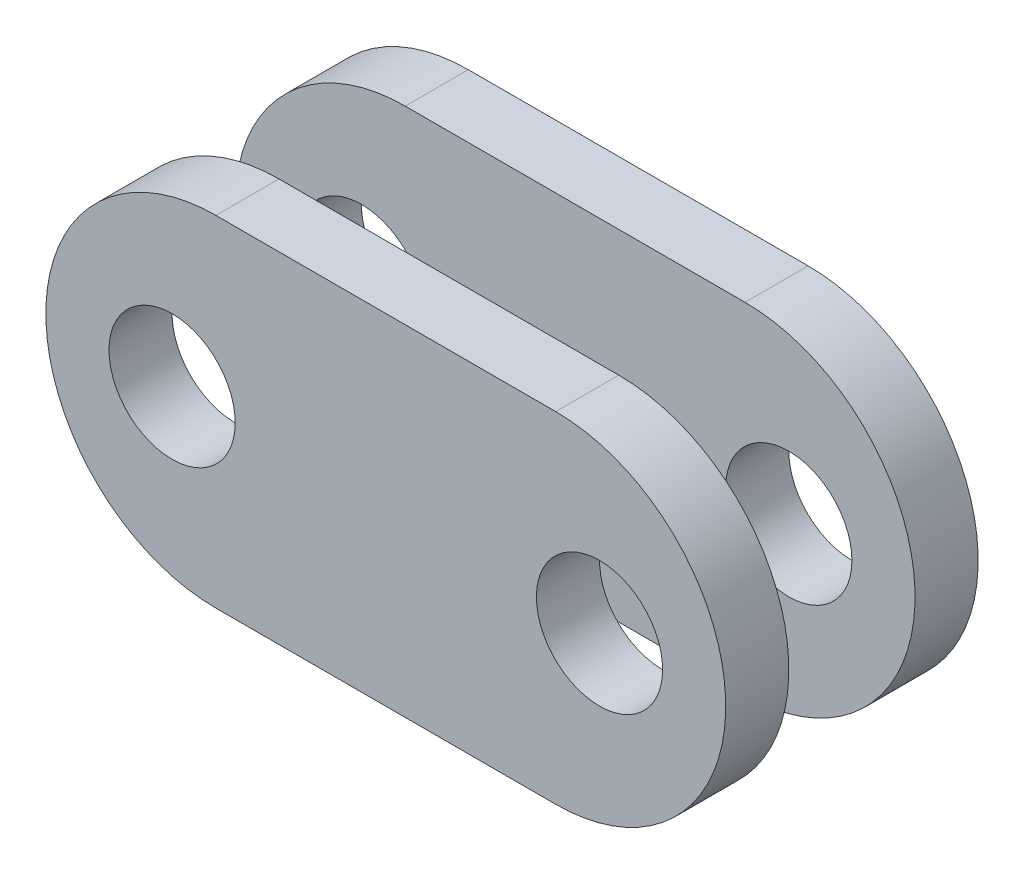
ISO-10303-21;
HEADER;
FILE_DESCRIPTION(('STEP AP214'),'2;1');
FILE_NAME('part.step','',(''),(''),'','','');
FILE_SCHEMA(('AUTOMOTIVE_DESIGN { 1 0 10303 214 1 1 1 1 }'));
ENDSEC;
DATA;
#1=APPLICATION_CONTEXT('core data for automotive mechanical design processes');
#2=APPLICATION_PROTOCOL_DEFINITION('international standard','automotive_design',2000,#1);
#3=PRODUCT_CONTEXT('',#1,'mechanical');
#4=PRODUCT('Part','Part','',(#3));
#5=PRODUCT_RELATED_PRODUCT_CATEGORY('part','',(#4));
#6=PRODUCT_DEFINITION_FORMATION('','',#4);
#7=PRODUCT_DEFINITION_CONTEXT('part definition',#1,'design');
#8=PRODUCT_DEFINITION('design','',#6,#7);
#9=PRODUCT_DEFINITION_SHAPE('','',#8);
#10=(LENGTH_UNIT() NAMED_UNIT(*) SI_UNIT(.MILLI.,.METRE.));
#11=(NAMED_UNIT(*) PLANE_ANGLE_UNIT() SI_UNIT($,.RADIAN.));
#12=(NAMED_UNIT(*) SI_UNIT($,.STERADIAN.) SOLID_ANGLE_UNIT());
#13=UNCERTAINTY_MEASURE_WITH_UNIT(LENGTH_MEASURE(1.E-05),#10,'distance_accuracy_value','');
#14=(GEOMETRIC_REPRESENTATION_CONTEXT(3) GLOBAL_UNCERTAINTY_ASSIGNED_CONTEXT((#13)) GLOBAL_UNIT_ASSIGNED_CONTEXT((#10,
#11,#12)) REPRESENTATION_CONTEXT('',''));
#15=CARTESIAN_POINT('',(0.,0.,0.));
#16=DIRECTION('',(0.,0.,1.));
#17=DIRECTION('',(1.,0.,0.));
#18=AXIS2_PLACEMENT_3D('',#15,#16,#17);
#19=CARTESIAN_POINT('',(-3.41919113428193,0.,7.62));
#20=DIRECTION('',(0.,0.,-1.));
#21=DIRECTION('',(-1.,0.,0.));
#22=AXIS2_PLACEMENT_3D('',#19,#20,#21);
#23=CYLINDRICAL_SURFACE('',#22,3.42276372831156);
#24=CARTESIAN_POINT('',(-3.41919113428193,0.,2.54));
#25=DIRECTION('',(0.,0.,-1.));
#26=DIRECTION('',(-1.,0.,0.));
#27=AXIS2_PLACEMENT_3D('',#24,#25,#26);
#28=CIRCLE('',#27,3.42276372831156);
#29=CARTESIAN_POINT('',(-3.41919113428193,-3.42276372831156,2.54));
#30=VERTEX_POINT('',#29);
#31=CARTESIAN_POINT('',(-3.41919113428193,3.42276372831156,2.54));
#32=VERTEX_POINT('',#31);
#33=EDGE_CURVE('E60',#30,#32,#28,.T.);
#34=ORIENTED_EDGE('',*,*,#33,.T.);
#35=DIRECTION('',(0.,0.,-1.));
#36=VECTOR('',#35,1.);
#37=CARTESIAN_POINT('',(-3.41919113428193,3.42276372831156,7.62));
#38=LINE('',#37,#36);
#39=CARTESIAN_POINT('',(-3.41919113428193,3.42276372831156,1.27));
#40=VERTEX_POINT('',#39);
#41=EDGE_CURVE('E47',#32,#40,#38,.T.);
#42=ORIENTED_EDGE('',*,*,#41,.T.);
#43=CARTESIAN_POINT('',(-3.41919113428193,0.,1.27));
#44=DIRECTION('',(0.,0.,1.));
#45=DIRECTION('',(1.,0.,0.));
#46=AXIS2_PLACEMENT_3D('',#43,#44,#45);
#47=CIRCLE('',#46,3.42276372831156);
#48=CARTESIAN_POINT('',(-3.41919113428193,-3.42276372831156,1.27));
#49=VERTEX_POINT('',#48);
#50=EDGE_CURVE('E94',#40,#49,#47,.T.);
#51=ORIENTED_EDGE('',*,*,#50,.T.);
#52=DIRECTION('',(0.,0.,-1.));
#53=VECTOR('',#52,1.);
#54=CARTESIAN_POINT('',(-3.41919113428193,-3.42276372831156,7.62));
#55=LINE('',#54,#53);
#56=EDGE_CURVE('E91',#30,#49,#55,.T.);
#57=ORIENTED_EDGE('',*,*,#56,.F.);
#58=EDGE_LOOP('',(#34,#42,#51,#57));
#59=FACE_BOUND('',#58,.T.);
#60=ADVANCED_FACE('F43',(#59),#23,.T.);
#61=CARTESIAN_POINT('',(-3.41919113428193,-3.42276372831156,7.62));
#62=DIRECTION('',(0.,1.,0.));
#63=DIRECTION('',(0.,0.,1.));
#64=AXIS2_PLACEMENT_3D('',#61,#62,#63);
#65=PLANE('',#64);
#66=DIRECTION('',(0.,0.,-1.));
#67=VECTOR('',#66,1.);
#68=CARTESIAN_POINT('',(3.41919113428193,-3.42276372831156,7.62));
#69=LINE('',#68,#67);
#70=CARTESIAN_POINT('',(3.41919113428193,-3.42276372831156,2.54));
#71=VERTEX_POINT('',#70);
#72=CARTESIAN_POINT('',(3.41919113428193,-3.42276372831156,1.27));
#73=VERTEX_POINT('',#72);
#74=EDGE_CURVE('E93',#71,#73,#69,.T.);
#75=ORIENTED_EDGE('',*,*,#74,.F.);
#76=DIRECTION('',(-1.,0.,0.));
#77=VECTOR('',#76,1.);
#78=CARTESIAN_POINT('',(-6.84195486259349,-3.42276372831156,2.54));
#79=LINE('',#78,#77);
#80=EDGE_CURVE('E84',#71,#30,#79,.T.);
#81=ORIENTED_EDGE('',*,*,#80,.T.);
#82=ORIENTED_EDGE('',*,*,#56,.T.);
#83=DIRECTION('',(1.,0.,0.));
#84=VECTOR('',#83,1.);
#85=CARTESIAN_POINT('',(-6.84195486259349,-3.42276372831156,1.27));
#86=LINE('',#85,#84);
#87=EDGE_CURVE('E98',#49,#73,#86,.T.);
#88=ORIENTED_EDGE('',*,*,#87,.T.);
#89=EDGE_LOOP('',(#75,#81,#82,#88));
#90=FACE_BOUND('',#89,.T.);
#91=ADVANCED_FACE('F89',(#90),#65,.F.);
#92=CARTESIAN_POINT('',(3.41919113428193,0.,7.62));
#93=DIRECTION('',(0.,0.,-1.));
#94=DIRECTION('',(-1.,0.,0.));
#95=AXIS2_PLACEMENT_3D('',#92,#93,#94);
#96=CYLINDRICAL_SURFACE('',#95,3.42276372831156);
#97=DIRECTION('',(0.,0.,-1.));
#98=VECTOR('',#97,1.);
#99=CARTESIAN_POINT('',(3.41919113428193,3.42276372831156,7.62));
#100=LINE('',#99,#98);
#101=CARTESIAN_POINT('',(3.41919113428193,3.42276372831156,2.54));
#102=VERTEX_POINT('',#101);
#103=CARTESIAN_POINT('',(3.41919113428193,3.42276372831156,1.27));
#104=VERTEX_POINT('',#103);
#105=EDGE_CURVE('E103',#102,#104,#100,.T.);
#106=ORIENTED_EDGE('',*,*,#105,.F.);
#107=CARTESIAN_POINT('',(3.41919113428193,0.,2.54));
#108=DIRECTION('',(0.,0.,-1.));
#109=DIRECTION('',(-1.,0.,0.));
#110=AXIS2_PLACEMENT_3D('',#107,#108,#109);
#111=CIRCLE('',#110,3.42276372831156);
#112=EDGE_CURVE('E67',#102,#71,#111,.T.);
#113=ORIENTED_EDGE('',*,*,#112,.T.);
#114=ORIENTED_EDGE('',*,*,#74,.T.);
#115=CARTESIAN_POINT('',(3.41919113428193,0.,1.27));
#116=DIRECTION('',(0.,0.,1.));
#117=DIRECTION('',(1.,0.,0.));
#118=AXIS2_PLACEMENT_3D('',#115,#116,#117);
#119=CIRCLE('',#118,3.42276372831156);
#120=EDGE_CURVE('E102',#73,#104,#119,.T.);
#121=ORIENTED_EDGE('',*,*,#120,.T.);
#122=EDGE_LOOP('',(#106,#113,#114,#121));
#123=FACE_BOUND('',#122,.T.);
#124=ADVANCED_FACE('F124',(#123),#96,.T.);
#125=CARTESIAN_POINT('',(-3.41919113428193,3.42276372831156,7.62));
#126=DIRECTION('',(0.,-1.,0.));
#127=DIRECTION('',(0.,0.,-1.));
#128=AXIS2_PLACEMENT_3D('',#125,#126,#127);
#129=PLANE('',#128);
#130=ORIENTED_EDGE('',*,*,#41,.F.);
#131=DIRECTION('',(-1.,0.,0.));
#132=VECTOR('',#131,1.);
#133=CARTESIAN_POINT('',(-6.84195486259349,3.42276372831156,2.54));
#134=LINE('',#133,#132);
#135=EDGE_CURVE('E12',#102,#32,#134,.T.);
#136=ORIENTED_EDGE('',*,*,#135,.F.);
#137=ORIENTED_EDGE('',*,*,#105,.T.);
#138=DIRECTION('',(1.,0.,0.));
#139=VECTOR('',#138,1.);
#140=CARTESIAN_POINT('',(-6.84195486259349,3.42276372831156,1.27));
#141=LINE('',#140,#139);
#142=EDGE_CURVE('E122',#40,#104,#141,.T.);
#143=ORIENTED_EDGE('',*,*,#142,.F.);
#144=EDGE_LOOP('',(#130,#136,#137,#143));
#145=FACE_BOUND('',#144,.T.);
#146=ADVANCED_FACE('F127',(#145),#129,.F.);
#147=CARTESIAN_POINT('',(-4.3012509031508,0.,0.));
#148=DIRECTION('',(0.,0.,1.));
#149=DIRECTION('',(1.,0.,0.));
#150=AXIS2_PLACEMENT_3D('',#147,#148,#149);
#151=CYLINDRICAL_SURFACE('',#150,1.27);
#152=CARTESIAN_POINT('',(-4.3012509031508,0.,2.54));
#153=DIRECTION('',(0.,0.,-1.));
#154=DIRECTION('',(-1.,0.,0.));
#155=AXIS2_PLACEMENT_3D('',#152,#153,#154);
#156=CIRCLE('',#155,1.27);
#157=CARTESIAN_POINT('',(-5.5712509031508,0.,2.54));
#158=VERTEX_POINT('',#157);
#159=EDGE_CURVE('E104',#158,#158,#156,.F.);
#160=ORIENTED_EDGE('',*,*,#159,.T.);
#161=EDGE_LOOP('',(#160));
#162=FACE_BOUND('',#161,.T.);
#163=CARTESIAN_POINT('',(-4.3012509031508,0.,1.27));
#164=DIRECTION('',(0.,0.,1.));
#165=DIRECTION('',(1.,0.,0.));
#166=AXIS2_PLACEMENT_3D('',#163,#164,#165);
#167=CIRCLE('',#166,1.27);
#168=CARTESIAN_POINT('',(-3.0312509031508,0.,1.27));
#169=VERTEX_POINT('',#168);
#170=EDGE_CURVE('E110',#169,#169,#167,.F.);
#171=ORIENTED_EDGE('',*,*,#170,.T.);
#172=EDGE_LOOP('',(#171));
#173=FACE_BOUND('',#172,.T.);
#174=ADVANCED_FACE('F129',(#162,#173),#151,.F.);
#175=CARTESIAN_POINT('',(4.3012509031508,0.,0.));
#176=DIRECTION('',(0.,0.,1.));
#177=DIRECTION('',(1.,0.,0.));
#178=AXIS2_PLACEMENT_3D('',#175,#176,#177);
#179=CYLINDRICAL_SURFACE('',#178,1.27);
#180=CARTESIAN_POINT('',(4.3012509031508,0.,2.54));
#181=DIRECTION('',(0.,0.,-1.));
#182=DIRECTION('',(-1.,0.,0.));
#183=AXIS2_PLACEMENT_3D('',#180,#181,#182);
#184=CIRCLE('',#183,1.27);
#185=CARTESIAN_POINT('',(3.0312509031508,0.,2.54));
#186=VERTEX_POINT('',#185);
#187=EDGE_CURVE('E52',#186,#186,#184,.T.);
#188=ORIENTED_EDGE('',*,*,#187,.F.);
#189=EDGE_LOOP('',(#188));
#190=FACE_BOUND('',#189,.T.);
#191=CARTESIAN_POINT('',(4.3012509031508,0.,1.27));
#192=DIRECTION('',(0.,0.,1.));
#193=DIRECTION('',(1.,0.,0.));
#194=AXIS2_PLACEMENT_3D('',#191,#192,#193);
#195=CIRCLE('',#194,1.27);
#196=CARTESIAN_POINT('',(5.5712509031508,0.,1.27));
#197=VERTEX_POINT('',#196);
#198=EDGE_CURVE('E121',#197,#197,#195,.T.);
#199=ORIENTED_EDGE('',*,*,#198,.F.);
#200=EDGE_LOOP('',(#199));
#201=FACE_BOUND('',#200,.T.);
#202=ADVANCED_FACE('F45',(#190,#201),#179,.F.);
#203=CARTESIAN_POINT('',(-6.84195486259349,-3.42276372831156,1.27));
#204=DIRECTION('',(0.,0.,1.));
#205=DIRECTION('',(1.,0.,0.));
#206=AXIS2_PLACEMENT_3D('',#203,#204,#205);
#207=PLANE('',#206);
#208=ORIENTED_EDGE('',*,*,#198,.T.);
#209=EDGE_LOOP('',(#208));
#210=FACE_BOUND('',#209,.T.);
#211=ORIENTED_EDGE('',*,*,#170,.F.);
#212=EDGE_LOOP('',(#211));
#213=FACE_BOUND('',#212,.T.);
#214=ORIENTED_EDGE('',*,*,#142,.T.);
#215=ORIENTED_EDGE('',*,*,#120,.F.);
#216=ORIENTED_EDGE('',*,*,#87,.F.);
#217=ORIENTED_EDGE('',*,*,#50,.F.);
#218=EDGE_LOOP('',(#214,#215,#216,#217));
#219=FACE_BOUND('',#218,.T.);
#220=ADVANCED_FACE('F126',(#210,#213,#219),#207,.F.);
#221=CARTESIAN_POINT('',(-6.84195486259349,-3.42276372831156,2.54));
#222=DIRECTION('',(0.,0.,-1.));
#223=DIRECTION('',(-1.,0.,0.));
#224=AXIS2_PLACEMENT_3D('',#221,#222,#223);
#225=PLANE('',#224);
#226=ORIENTED_EDGE('',*,*,#187,.T.);
#227=EDGE_LOOP('',(#226));
#228=FACE_BOUND('',#227,.T.);
#229=ORIENTED_EDGE('',*,*,#159,.F.);
#230=EDGE_LOOP('',(#229));
#231=FACE_BOUND('',#230,.T.);
#232=ORIENTED_EDGE('',*,*,#33,.F.);
#233=ORIENTED_EDGE('',*,*,#80,.F.);
#234=ORIENTED_EDGE('',*,*,#112,.F.);
#235=ORIENTED_EDGE('',*,*,#135,.T.);
#236=EDGE_LOOP('',(#232,#233,#234,#235));
#237=FACE_BOUND('',#236,.T.);
#238=ADVANCED_FACE('F83',(#228,#231,#237),#225,.F.);
#239=CLOSED_SHELL('',(#60,#91,#124,#146,#174,#202,#220,#238));
#240=MANIFOLD_SOLID_BREP('B2',#239);
#241=CARTESIAN_POINT('',(-4.3012509031508,0.,0.));
#242=DIRECTION('',(0.,0.,1.));
#243=DIRECTION('',(1.,0.,0.));
#244=AXIS2_PLACEMENT_3D('',#241,#242,#243);
#245=CYLINDRICAL_SURFACE('',#244,1.27);
#246=CARTESIAN_POINT('',(-4.3012509031508,0.,5.07999999999999));
#247=DIRECTION('',(0.,0.,1.));
#248=DIRECTION('',(1.,0.,0.));
#249=AXIS2_PLACEMENT_3D('',#246,#247,#248);
#250=CIRCLE('',#249,1.27);
#251=CARTESIAN_POINT('',(-3.0312509031508,0.,5.07999999999999));
#252=VERTEX_POINT('',#251);
#253=EDGE_CURVE('E260',#252,#252,#250,.F.);
#254=ORIENTED_EDGE('',*,*,#253,.T.);
#255=EDGE_LOOP('',(#254));
#256=FACE_BOUND('',#255,.T.);
#257=CARTESIAN_POINT('',(-4.3012509031508,0.,6.35));
#258=DIRECTION('',(0.,0.,-1.));
#259=DIRECTION('',(-1.,0.,0.));
#260=AXIS2_PLACEMENT_3D('',#257,#258,#259);
#261=CIRCLE('',#260,1.27);
#262=CARTESIAN_POINT('',(-5.5712509031508,0.,6.35));
#263=VERTEX_POINT('',#262);
#264=EDGE_CURVE('E278',#263,#263,#261,.T.);
#265=ORIENTED_EDGE('',*,*,#264,.F.);
#266=EDGE_LOOP('',(#265));
#267=FACE_BOUND('',#266,.T.);
#268=ADVANCED_FACE('F209',(#256,#267),#245,.F.);
#269=CARTESIAN_POINT('',(-3.41919113428193,3.42276372831156,7.62));
#270=DIRECTION('',(0.,-1.,0.));
#271=DIRECTION('',(0.,0.,-1.));
#272=AXIS2_PLACEMENT_3D('',#269,#270,#271);
#273=PLANE('',#272);
#274=DIRECTION('',(0.,0.,-1.));
#275=VECTOR('',#274,1.);
#276=CARTESIAN_POINT('',(3.41919113428193,3.42276372831156,7.62));
#277=LINE('',#276,#275);
#278=CARTESIAN_POINT('',(3.41919113428193,3.42276372831156,6.35));
#279=VERTEX_POINT('',#278);
#280=CARTESIAN_POINT('',(3.41919113428193,3.42276372831156,5.07999999999999));
#281=VERTEX_POINT('',#280);
#282=EDGE_CURVE('E257',#279,#281,#277,.T.);
#283=ORIENTED_EDGE('',*,*,#282,.T.);
#284=DIRECTION('',(1.,0.,0.));
#285=VECTOR('',#284,1.);
#286=CARTESIAN_POINT('',(-6.84195486259349,3.42276372831156,5.07999999999999));
#287=LINE('',#286,#285);
#288=CARTESIAN_POINT('',(-3.41919113428193,3.42276372831156,5.07999999999999));
#289=VERTEX_POINT('',#288);
#290=EDGE_CURVE('E262',#289,#281,#287,.T.);
#291=ORIENTED_EDGE('',*,*,#290,.F.);
#292=DIRECTION('',(0.,0.,-1.));
#293=VECTOR('',#292,1.);
#294=CARTESIAN_POINT('',(-3.41919113428193,3.42276372831156,7.62));
#295=LINE('',#294,#293);
#296=CARTESIAN_POINT('',(-3.41919113428193,3.42276372831156,6.35));
#297=VERTEX_POINT('',#296);
#298=EDGE_CURVE('E271',#297,#289,#295,.T.);
#299=ORIENTED_EDGE('',*,*,#298,.F.);
#300=DIRECTION('',(-1.,0.,0.));
#301=VECTOR('',#300,1.);
#302=CARTESIAN_POINT('',(-6.84195486259349,3.42276372831156,6.35));
#303=LINE('',#302,#301);
#304=EDGE_CURVE('E270',#279,#297,#303,.T.);
#305=ORIENTED_EDGE('',*,*,#304,.F.);
#306=EDGE_LOOP('',(#283,#291,#299,#305));
#307=FACE_BOUND('',#306,.T.);
#308=ADVANCED_FACE('F269',(#307),#273,.F.);
#309=CARTESIAN_POINT('',(3.41919113428193,0.,7.62));
#310=DIRECTION('',(0.,0.,-1.));
#311=DIRECTION('',(-1.,0.,0.));
#312=AXIS2_PLACEMENT_3D('',#309,#310,#311);
#313=CYLINDRICAL_SURFACE('',#312,3.42276372831156);
#314=CARTESIAN_POINT('',(3.41919113428193,0.,5.07999999999999));
#315=DIRECTION('',(0.,0.,1.));
#316=DIRECTION('',(1.,0.,0.));
#317=AXIS2_PLACEMENT_3D('',#314,#315,#316);
#318=CIRCLE('',#317,3.42276372831156);
#319=CARTESIAN_POINT('',(3.41919113428193,-3.42276372831156,5.07999999999999));
#320=VERTEX_POINT('',#319);
#321=EDGE_CURVE('E254',#320,#281,#318,.T.);
#322=ORIENTED_EDGE('',*,*,#321,.T.);
#323=ORIENTED_EDGE('',*,*,#282,.F.);
#324=CARTESIAN_POINT('',(3.41919113428193,0.,6.35));
#325=DIRECTION('',(0.,0.,-1.));
#326=DIRECTION('',(-1.,0.,0.));
#327=AXIS2_PLACEMENT_3D('',#324,#325,#326);
#328=CIRCLE('',#327,3.42276372831156);
#329=CARTESIAN_POINT('',(3.41919113428193,-3.42276372831156,6.35));
#330=VERTEX_POINT('',#329);
#331=EDGE_CURVE('E234',#279,#330,#328,.T.);
#332=ORIENTED_EDGE('',*,*,#331,.T.);
#333=DIRECTION('',(0.,0.,-1.));
#334=VECTOR('',#333,1.);
#335=CARTESIAN_POINT('',(3.41919113428193,-3.42276372831156,7.62));
#336=LINE('',#335,#334);
#337=EDGE_CURVE('E218',#330,#320,#336,.T.);
#338=ORIENTED_EDGE('',*,*,#337,.T.);
#339=EDGE_LOOP('',(#322,#323,#332,#338));
#340=FACE_BOUND('',#339,.T.);
#341=ADVANCED_FACE('F255',(#340),#313,.T.);
#342=CARTESIAN_POINT('',(-3.41919113428193,-3.42276372831156,7.62));
#343=DIRECTION('',(0.,1.,0.));
#344=DIRECTION('',(0.,0.,1.));
#345=AXIS2_PLACEMENT_3D('',#342,#343,#344);
#346=PLANE('',#345);
#347=DIRECTION('',(0.,0.,-1.));
#348=VECTOR('',#347,1.);
#349=CARTESIAN_POINT('',(-3.41919113428193,-3.42276372831156,7.62));
#350=LINE('',#349,#348);
#351=CARTESIAN_POINT('',(-3.41919113428193,-3.42276372831156,6.35));
#352=VERTEX_POINT('',#351);
#353=CARTESIAN_POINT('',(-3.41919113428193,-3.42276372831156,5.07999999999999));
#354=VERTEX_POINT('',#353);
#355=EDGE_CURVE('E41',#352,#354,#350,.T.);
#356=ORIENTED_EDGE('',*,*,#355,.T.);
#357=DIRECTION('',(1.,0.,0.));
#358=VECTOR('',#357,1.);
#359=CARTESIAN_POINT('',(-6.84195486259349,-3.42276372831156,5.07999999999999));
#360=LINE('',#359,#358);
#361=EDGE_CURVE('E267',#354,#320,#360,.T.);
#362=ORIENTED_EDGE('',*,*,#361,.T.);
#363=ORIENTED_EDGE('',*,*,#337,.F.);
#364=DIRECTION('',(-1.,0.,0.));
#365=VECTOR('',#364,1.);
#366=CARTESIAN_POINT('',(-6.84195486259349,-3.42276372831156,6.35));
#367=LINE('',#366,#365);
#368=EDGE_CURVE('E289',#330,#352,#367,.T.);
#369=ORIENTED_EDGE('',*,*,#368,.T.);
#370=EDGE_LOOP('',(#356,#362,#363,#369));
#371=FACE_BOUND('',#370,.T.);
#372=ADVANCED_FACE('F313',(#371),#346,.F.);
#373=CARTESIAN_POINT('',(-3.41919113428193,0.,7.62));
#374=DIRECTION('',(0.,0.,-1.));
#375=DIRECTION('',(-1.,0.,0.));
#376=AXIS2_PLACEMENT_3D('',#373,#374,#375);
#377=CYLINDRICAL_SURFACE('',#376,3.42276372831156);
#378=ORIENTED_EDGE('',*,*,#298,.T.);
#379=CARTESIAN_POINT('',(-3.41919113428193,0.,5.07999999999999));
#380=DIRECTION('',(0.,0.,1.));
#381=DIRECTION('',(1.,0.,0.));
#382=AXIS2_PLACEMENT_3D('',#379,#380,#381);
#383=CIRCLE('',#382,3.42276372831156);
#384=EDGE_CURVE('E226',#289,#354,#383,.T.);
#385=ORIENTED_EDGE('',*,*,#384,.T.);
#386=ORIENTED_EDGE('',*,*,#355,.F.);
#387=CARTESIAN_POINT('',(-3.41919113428193,0.,6.35));
#388=DIRECTION('',(0.,0.,-1.));
#389=DIRECTION('',(-1.,0.,0.));
#390=AXIS2_PLACEMENT_3D('',#387,#388,#389);
#391=CIRCLE('',#390,3.42276372831156);
#392=EDGE_CURVE('E274',#352,#297,#391,.T.);
#393=ORIENTED_EDGE('',*,*,#392,.T.);
#394=EDGE_LOOP('',(#378,#385,#386,#393));
#395=FACE_BOUND('',#394,.T.);
#396=ADVANCED_FACE('F211',(#395),#377,.T.);
#397=CARTESIAN_POINT('',(-6.84195486259349,-3.42276372831156,6.35));
#398=DIRECTION('',(0.,0.,-1.));
#399=DIRECTION('',(-1.,0.,0.));
#400=AXIS2_PLACEMENT_3D('',#397,#398,#399);
#401=PLANE('',#400);
#402=ORIENTED_EDGE('',*,*,#392,.F.);
#403=ORIENTED_EDGE('',*,*,#368,.F.);
#404=ORIENTED_EDGE('',*,*,#331,.F.);
#405=ORIENTED_EDGE('',*,*,#304,.T.);
#406=EDGE_LOOP('',(#402,#403,#404,#405));
#407=FACE_BOUND('',#406,.T.);
#408=ORIENTED_EDGE('',*,*,#264,.T.);
#409=EDGE_LOOP('',(#408));
#410=FACE_BOUND('',#409,.T.);
#411=CARTESIAN_POINT('',(4.3012509031508,0.,6.35));
#412=DIRECTION('',(0.,0.,-1.));
#413=DIRECTION('',(-1.,0.,0.));
#414=AXIS2_PLACEMENT_3D('',#411,#412,#413);
#415=CIRCLE('',#414,1.27);
#416=CARTESIAN_POINT('',(3.0312509031508,0.,6.35));
#417=VERTEX_POINT('',#416);
#418=EDGE_CURVE('E280',#417,#417,#415,.F.);
#419=ORIENTED_EDGE('',*,*,#418,.F.);
#420=EDGE_LOOP('',(#419));
#421=FACE_BOUND('',#420,.T.);
#422=ADVANCED_FACE('F293',(#407,#410,#421),#401,.F.);
#423=CARTESIAN_POINT('',(4.3012509031508,0.,0.));
#424=DIRECTION('',(0.,0.,1.));
#425=DIRECTION('',(1.,0.,0.));
#426=AXIS2_PLACEMENT_3D('',#423,#424,#425);
#427=CYLINDRICAL_SURFACE('',#426,1.27);
#428=CARTESIAN_POINT('',(4.3012509031508,0.,5.07999999999999));
#429=DIRECTION('',(0.,0.,1.));
#430=DIRECTION('',(1.,0.,0.));
#431=AXIS2_PLACEMENT_3D('',#428,#429,#430);
#432=CIRCLE('',#431,1.27);
#433=CARTESIAN_POINT('',(5.5712509031508,0.,5.07999999999999));
#434=VERTEX_POINT('',#433);
#435=EDGE_CURVE('E213',#434,#434,#432,.T.);
#436=ORIENTED_EDGE('',*,*,#435,.F.);
#437=EDGE_LOOP('',(#436));
#438=FACE_BOUND('',#437,.T.);
#439=ORIENTED_EDGE('',*,*,#418,.T.);
#440=EDGE_LOOP('',(#439));
#441=FACE_BOUND('',#440,.T.);
#442=ADVANCED_FACE('F296',(#438,#441),#427,.F.);
#443=CARTESIAN_POINT('',(-6.84195486259349,-3.42276372831156,5.07999999999999));
#444=DIRECTION('',(0.,0.,1.));
#445=DIRECTION('',(1.,0.,0.));
#446=AXIS2_PLACEMENT_3D('',#443,#444,#445);
#447=PLANE('',#446);
#448=ORIENTED_EDGE('',*,*,#435,.T.);
#449=EDGE_LOOP('',(#448));
#450=FACE_BOUND('',#449,.T.);
#451=ORIENTED_EDGE('',*,*,#253,.F.);
#452=EDGE_LOOP('',(#451));
#453=FACE_BOUND('',#452,.T.);
#454=ORIENTED_EDGE('',*,*,#290,.T.);
#455=ORIENTED_EDGE('',*,*,#321,.F.);
#456=ORIENTED_EDGE('',*,*,#361,.F.);
#457=ORIENTED_EDGE('',*,*,#384,.F.);
#458=EDGE_LOOP('',(#454,#455,#456,#457));
#459=FACE_BOUND('',#458,.T.);
#460=ADVANCED_FACE('F263',(#450,#453,#459),#447,.F.);
#461=CLOSED_SHELL('',(#268,#308,#341,#372,#396,#422,#442,#460));
#462=MANIFOLD_SOLID_BREP('B6',#461);
#463=ADVANCED_BREP_SHAPE_REPRESENTATION('',(#18,#240,#462),#14);
#464=SHAPE_DEFINITION_REPRESENTATION(#9,#463);
ENDSEC;
END-ISO-10303-21;
